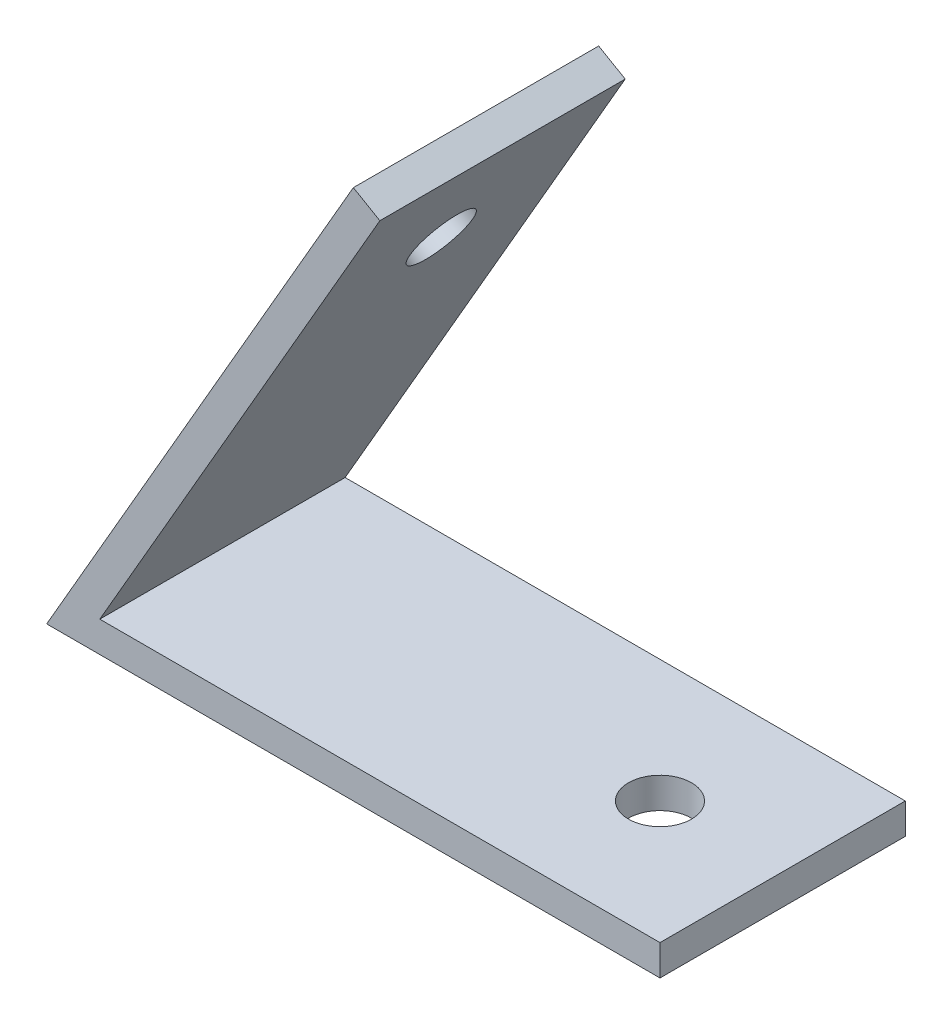
ISO-10303-21;
HEADER;
FILE_DESCRIPTION(('STEP AP214'),'2;1');
FILE_NAME('part.step','',(''),(''),'','','');
FILE_SCHEMA(('AUTOMOTIVE_DESIGN { 1 0 10303 214 1 1 1 1 }'));
ENDSEC;
DATA;
#1=APPLICATION_CONTEXT('core data for automotive mechanical design processes');
#2=APPLICATION_PROTOCOL_DEFINITION('international standard','automotive_design',2000,#1);
#3=PRODUCT_CONTEXT('',#1,'mechanical');
#4=PRODUCT('Part','Part','',(#3));
#5=PRODUCT_RELATED_PRODUCT_CATEGORY('part','',(#4));
#6=PRODUCT_DEFINITION_FORMATION('','',#4);
#7=PRODUCT_DEFINITION_CONTEXT('part definition',#1,'design');
#8=PRODUCT_DEFINITION('design','',#6,#7);
#9=PRODUCT_DEFINITION_SHAPE('','',#8);
#10=(LENGTH_UNIT() NAMED_UNIT(*) SI_UNIT(.MILLI.,.METRE.));
#11=(NAMED_UNIT(*) PLANE_ANGLE_UNIT() SI_UNIT($,.RADIAN.));
#12=(NAMED_UNIT(*) SI_UNIT($,.STERADIAN.) SOLID_ANGLE_UNIT());
#13=UNCERTAINTY_MEASURE_WITH_UNIT(LENGTH_MEASURE(1.E-05),#10,'distance_accuracy_value','');
#14=(GEOMETRIC_REPRESENTATION_CONTEXT(3) GLOBAL_UNCERTAINTY_ASSIGNED_CONTEXT((#13)) GLOBAL_UNIT_ASSIGNED_CONTEXT((#10,
#11,#12)) REPRESENTATION_CONTEXT('',''));
#15=CARTESIAN_POINT('',(0.,0.,0.));
#16=DIRECTION('',(0.,0.,1.));
#17=DIRECTION('',(1.,0.,0.));
#18=AXIS2_PLACEMENT_3D('',#15,#16,#17);
#19=CARTESIAN_POINT('',(31.75,0.,12.7));
#20=DIRECTION('',(-1.,0.,0.));
#21=DIRECTION('',(0.,0.,1.));
#22=AXIS2_PLACEMENT_3D('',#19,#20,#21);
#23=PLANE('',#22);
#24=DIRECTION('',(0.,1.,0.));
#25=VECTOR('',#24,1.);
#26=CARTESIAN_POINT('',(31.75,0.,0.));
#27=LINE('',#26,#25);
#28=CARTESIAN_POINT('',(31.75,0.,0.));
#29=VERTEX_POINT('',#28);
#30=CARTESIAN_POINT('',(31.75,1.5875,0.));
#31=VERTEX_POINT('',#30);
#32=EDGE_CURVE('E141',#29,#31,#27,.T.);
#33=ORIENTED_EDGE('',*,*,#32,.T.);
#34=DIRECTION('',(0.,0.,-1.));
#35=VECTOR('',#34,1.);
#36=CARTESIAN_POINT('',(31.75,1.5875,12.7));
#37=LINE('',#36,#35);
#38=CARTESIAN_POINT('',(31.75,1.5875,12.7));
#39=VERTEX_POINT('',#38);
#40=EDGE_CURVE('E11',#39,#31,#37,.T.);
#41=ORIENTED_EDGE('',*,*,#40,.F.);
#42=DIRECTION('',(0.,1.,0.));
#43=VECTOR('',#42,1.);
#44=CARTESIAN_POINT('',(31.75,0.,12.7));
#45=LINE('',#44,#43);
#46=CARTESIAN_POINT('',(31.75,0.,12.7));
#47=VERTEX_POINT('',#46);
#48=EDGE_CURVE('E157',#47,#39,#45,.T.);
#49=ORIENTED_EDGE('',*,*,#48,.F.);
#50=DIRECTION('',(0.,0.,-1.));
#51=VECTOR('',#50,1.);
#52=CARTESIAN_POINT('',(31.75,0.,12.7));
#53=LINE('',#52,#51);
#54=EDGE_CURVE('E137',#47,#29,#53,.T.);
#55=ORIENTED_EDGE('',*,*,#54,.T.);
#56=EDGE_LOOP('',(#33,#41,#49,#55));
#57=FACE_BOUND('',#56,.T.);
#58=ADVANCED_FACE('F38',(#57),#23,.F.);
#59=CARTESIAN_POINT('',(2.74963065701557,1.5875,12.7));
#60=DIRECTION('',(0.,-1.,0.));
#61=DIRECTION('',(0.,0.,-1.));
#62=AXIS2_PLACEMENT_3D('',#59,#60,#61);
#63=PLANE('',#62);
#64=CARTESIAN_POINT('',(25.4,1.5875,6.35));
#65=DIRECTION('',(0.,-1.,0.));
#66=DIRECTION('',(0.,0.,-1.));
#67=AXIS2_PLACEMENT_3D('',#64,#65,#66);
#68=CIRCLE('',#67,1.63194999999999);
#69=CARTESIAN_POINT('',(25.4,1.5875,4.71805000000001));
#70=VERTEX_POINT('',#69);
#71=EDGE_CURVE('E146',#70,#70,#68,.T.);
#72=ORIENTED_EDGE('',*,*,#71,.T.);
#73=EDGE_LOOP('',(#72));
#74=FACE_BOUND('',#73,.T.);
#75=DIRECTION('',(-1.,0.,0.));
#76=VECTOR('',#75,1.);
#77=CARTESIAN_POINT('',(2.74963065701557,1.5875,0.));
#78=LINE('',#77,#76);
#79=CARTESIAN_POINT('',(2.74963065701557,1.5875,0.));
#80=VERTEX_POINT('',#79);
#81=EDGE_CURVE('E145',#31,#80,#78,.T.);
#82=ORIENTED_EDGE('',*,*,#81,.T.);
#83=DIRECTION('',(0.,0.,-1.));
#84=VECTOR('',#83,1.);
#85=CARTESIAN_POINT('',(2.74963065701557,1.5875,12.7));
#86=LINE('',#85,#84);
#87=CARTESIAN_POINT('',(2.74963065701557,1.5875,12.7));
#88=VERTEX_POINT('',#87);
#89=EDGE_CURVE('E47',#88,#80,#86,.T.);
#90=ORIENTED_EDGE('',*,*,#89,.F.);
#91=DIRECTION('',(-1.,0.,0.));
#92=VECTOR('',#91,1.);
#93=CARTESIAN_POINT('',(2.74963065701557,1.5875,12.7));
#94=LINE('',#93,#92);
#95=EDGE_CURVE('E104',#39,#88,#94,.T.);
#96=ORIENTED_EDGE('',*,*,#95,.F.);
#97=ORIENTED_EDGE('',*,*,#40,.T.);
#98=EDGE_LOOP('',(#82,#90,#96,#97));
#99=FACE_BOUND('',#98,.T.);
#100=ADVANCED_FACE('F189',(#74,#99),#63,.F.);
#101=CARTESIAN_POINT('',(2.74963065701557,1.5875,12.7));
#102=DIRECTION('',(-0.86602540378444,0.499999999999998,0.));
#103=DIRECTION('',(-0.499999999999998,-0.86602540378444,0.));
#104=AXIS2_PLACEMENT_3D('',#101,#102,#103);
#105=PLANE('',#104);
#106=CARTESIAN_POINT('',(14.0748153285077,21.2032952561248,6.35));
#107=DIRECTION('',(-0.86602540378444,0.499999999999998,0.));
#108=DIRECTION('',(-0.499999999999998,-0.86602540378444,0.));
#109=AXIS2_PLACEMENT_3D('',#106,#107,#108);
#110=CIRCLE('',#109,1.63194999999999);
#111=CARTESIAN_POINT('',(13.2588403285077,19.7899850984188,6.35));
#112=VERTEX_POINT('',#111);
#113=EDGE_CURVE('E274',#112,#112,#110,.T.);
#114=ORIENTED_EDGE('',*,*,#113,.T.);
#115=EDGE_LOOP('',(#114));
#116=FACE_BOUND('',#115,.T.);
#117=DIRECTION('',(0.499999999999998,0.86602540378444,0.));
#118=VECTOR('',#117,1.);
#119=CARTESIAN_POINT('',(2.74963065701557,1.5875,0.));
#120=LINE('',#119,#118);
#121=CARTESIAN_POINT('',(17.2498153285077,26.702556570156,0.));
#122=VERTEX_POINT('',#121);
#123=EDGE_CURVE('E149',#80,#122,#120,.T.);
#124=ORIENTED_EDGE('',*,*,#123,.T.);
#125=DIRECTION('',(0.,0.,-1.));
#126=VECTOR('',#125,1.);
#127=CARTESIAN_POINT('',(17.2498153285077,26.702556570156,12.7));
#128=LINE('',#127,#126);
#129=CARTESIAN_POINT('',(17.2498153285077,26.702556570156,12.7));
#130=VERTEX_POINT('',#129);
#131=EDGE_CURVE('E128',#130,#122,#128,.T.);
#132=ORIENTED_EDGE('',*,*,#131,.F.);
#133=DIRECTION('',(0.499999999999998,0.86602540378444,0.));
#134=VECTOR('',#133,1.);
#135=CARTESIAN_POINT('',(2.74963065701557,1.5875,12.7));
#136=LINE('',#135,#134);
#137=EDGE_CURVE('E117',#88,#130,#136,.T.);
#138=ORIENTED_EDGE('',*,*,#137,.F.);
#139=ORIENTED_EDGE('',*,*,#89,.T.);
#140=EDGE_LOOP('',(#124,#132,#138,#139));
#141=FACE_BOUND('',#140,.T.);
#142=ADVANCED_FACE('F167',(#116,#141),#105,.F.);
#143=CARTESIAN_POINT('',(17.2498153285077,26.702556570156,12.7));
#144=DIRECTION('',(-0.499999999999996,-0.866025403784441,0.));
#145=DIRECTION('',(0.866025403784441,-0.499999999999996,0.));
#146=AXIS2_PLACEMENT_3D('',#143,#144,#145);
#147=PLANE('',#146);
#148=DIRECTION('',(-0.866025403784441,0.499999999999996,0.));
#149=VECTOR('',#148,1.);
#150=CARTESIAN_POINT('',(17.2498153285077,26.702556570156,0.));
#151=LINE('',#150,#149);
#152=CARTESIAN_POINT('',(15.8749999999999,27.496306570156,0.));
#153=VERTEX_POINT('',#152);
#154=EDGE_CURVE('E126',#122,#153,#151,.T.);
#155=ORIENTED_EDGE('',*,*,#154,.T.);
#156=DIRECTION('',(0.,0.,-1.));
#157=VECTOR('',#156,1.);
#158=CARTESIAN_POINT('',(15.8749999999999,27.496306570156,12.7));
#159=LINE('',#158,#157);
#160=CARTESIAN_POINT('',(15.8749999999999,27.496306570156,12.7));
#161=VERTEX_POINT('',#160);
#162=EDGE_CURVE('E123',#161,#153,#159,.T.);
#163=ORIENTED_EDGE('',*,*,#162,.F.);
#164=DIRECTION('',(-0.866025403784441,0.499999999999996,0.));
#165=VECTOR('',#164,1.);
#166=CARTESIAN_POINT('',(17.2498153285077,26.702556570156,12.7));
#167=LINE('',#166,#165);
#168=EDGE_CURVE('E111',#130,#161,#167,.T.);
#169=ORIENTED_EDGE('',*,*,#168,.F.);
#170=ORIENTED_EDGE('',*,*,#131,.T.);
#171=EDGE_LOOP('',(#155,#163,#169,#170));
#172=FACE_BOUND('',#171,.T.);
#173=ADVANCED_FACE('F124',(#172),#147,.F.);
#174=CARTESIAN_POINT('',(15.8749999999999,27.496306570156,12.7));
#175=DIRECTION('',(0.86602540378444,-0.499999999999997,0.));
#176=DIRECTION('',(0.499999999999997,0.86602540378444,0.));
#177=AXIS2_PLACEMENT_3D('',#174,#175,#176);
#178=PLANE('',#177);
#179=CARTESIAN_POINT('',(12.6999999999999,21.9970452561248,6.35));
#180=DIRECTION('',(-0.86602540378444,0.499999999999997,0.));
#181=DIRECTION('',(-0.499999999999997,-0.86602540378444,0.));
#182=AXIS2_PLACEMENT_3D('',#179,#180,#181);
#183=CIRCLE('',#182,1.63194999999999);
#184=CARTESIAN_POINT('',(11.8840249999999,20.5837350984188,6.35));
#185=VERTEX_POINT('',#184);
#186=EDGE_CURVE('E277',#185,#185,#183,.T.);
#187=ORIENTED_EDGE('',*,*,#186,.F.);
#188=EDGE_LOOP('',(#187));
#189=FACE_BOUND('',#188,.T.);
#190=DIRECTION('',(-0.499999999999997,-0.86602540378444,0.));
#191=VECTOR('',#190,1.);
#192=CARTESIAN_POINT('',(15.8749999999999,27.496306570156,0.));
#193=LINE('',#192,#191);
#194=CARTESIAN_POINT('',(0.,0.,0.));
#195=VERTEX_POINT('',#194);
#196=EDGE_CURVE('E87',#153,#195,#193,.T.);
#197=ORIENTED_EDGE('',*,*,#196,.T.);
#198=DIRECTION('',(0.,0.,-1.));
#199=VECTOR('',#198,1.);
#200=CARTESIAN_POINT('',(0.,0.,12.7));
#201=LINE('',#200,#199);
#202=CARTESIAN_POINT('',(0.,0.,12.7));
#203=VERTEX_POINT('',#202);
#204=EDGE_CURVE('E129',#203,#195,#201,.T.);
#205=ORIENTED_EDGE('',*,*,#204,.F.);
#206=DIRECTION('',(-0.499999999999997,-0.86602540378444,0.));
#207=VECTOR('',#206,1.);
#208=CARTESIAN_POINT('',(15.8749999999999,27.496306570156,12.7));
#209=LINE('',#208,#207);
#210=EDGE_CURVE('E115',#161,#203,#209,.T.);
#211=ORIENTED_EDGE('',*,*,#210,.F.);
#212=ORIENTED_EDGE('',*,*,#162,.T.);
#213=EDGE_LOOP('',(#197,#205,#211,#212));
#214=FACE_BOUND('',#213,.T.);
#215=ADVANCED_FACE('F131',(#189,#214),#178,.F.);
#216=CARTESIAN_POINT('',(0.,0.,12.7));
#217=DIRECTION('',(0.,1.,0.));
#218=DIRECTION('',(0.,0.,1.));
#219=AXIS2_PLACEMENT_3D('',#216,#217,#218);
#220=PLANE('',#219);
#221=CARTESIAN_POINT('',(25.4,0.,6.35));
#222=DIRECTION('',(0.,-1.,0.));
#223=DIRECTION('',(0.,0.,-1.));
#224=AXIS2_PLACEMENT_3D('',#221,#222,#223);
#225=CIRCLE('',#224,1.63194999999999);
#226=CARTESIAN_POINT('',(25.4,0.,4.71805000000001));
#227=VERTEX_POINT('',#226);
#228=EDGE_CURVE('E281',#227,#227,#225,.T.);
#229=ORIENTED_EDGE('',*,*,#228,.F.);
#230=EDGE_LOOP('',(#229));
#231=FACE_BOUND('',#230,.T.);
#232=DIRECTION('',(1.,0.,0.));
#233=VECTOR('',#232,1.);
#234=CARTESIAN_POINT('',(0.,0.,0.));
#235=LINE('',#234,#233);
#236=EDGE_CURVE('E95',#195,#29,#235,.T.);
#237=ORIENTED_EDGE('',*,*,#236,.T.);
#238=ORIENTED_EDGE('',*,*,#54,.F.);
#239=DIRECTION('',(1.,0.,0.));
#240=VECTOR('',#239,1.);
#241=CARTESIAN_POINT('',(0.,0.,12.7));
#242=LINE('',#241,#240);
#243=EDGE_CURVE('E57',#203,#47,#242,.T.);
#244=ORIENTED_EDGE('',*,*,#243,.F.);
#245=ORIENTED_EDGE('',*,*,#204,.T.);
#246=EDGE_LOOP('',(#237,#238,#244,#245));
#247=FACE_BOUND('',#246,.T.);
#248=ADVANCED_FACE('F174',(#231,#247),#220,.F.);
#249=CARTESIAN_POINT('',(0.,0.,12.7));
#250=DIRECTION('',(0.,0.,-1.));
#251=DIRECTION('',(-1.,0.,0.));
#252=AXIS2_PLACEMENT_3D('',#249,#250,#251);
#253=PLANE('',#252);
#254=ORIENTED_EDGE('',*,*,#48,.T.);
#255=ORIENTED_EDGE('',*,*,#95,.T.);
#256=ORIENTED_EDGE('',*,*,#137,.T.);
#257=ORIENTED_EDGE('',*,*,#168,.T.);
#258=ORIENTED_EDGE('',*,*,#210,.T.);
#259=ORIENTED_EDGE('',*,*,#243,.T.);
#260=EDGE_LOOP('',(#254,#255,#256,#257,#258,#259));
#261=FACE_BOUND('',#260,.T.);
#262=ADVANCED_FACE('F113',(#261),#253,.F.);
#263=CARTESIAN_POINT('',(0.,0.,0.));
#264=DIRECTION('',(0.,0.,-1.));
#265=DIRECTION('',(-1.,0.,0.));
#266=AXIS2_PLACEMENT_3D('',#263,#264,#265);
#267=PLANE('',#266);
#268=ORIENTED_EDGE('',*,*,#32,.F.);
#269=ORIENTED_EDGE('',*,*,#236,.F.);
#270=ORIENTED_EDGE('',*,*,#196,.F.);
#271=ORIENTED_EDGE('',*,*,#154,.F.);
#272=ORIENTED_EDGE('',*,*,#123,.F.);
#273=ORIENTED_EDGE('',*,*,#81,.F.);
#274=EDGE_LOOP('',(#268,#269,#270,#271,#272,#273));
#275=FACE_BOUND('',#274,.T.);
#276=ADVANCED_FACE('F170',(#275),#267,.T.);
#277=CARTESIAN_POINT('',(25.4,0.,6.35));
#278=DIRECTION('',(0.,-1.,0.));
#279=DIRECTION('',(0.,0.,-1.));
#280=AXIS2_PLACEMENT_3D('',#277,#278,#279);
#281=CYLINDRICAL_SURFACE('',#280,1.63194999999999);
#282=ORIENTED_EDGE('',*,*,#71,.F.);
#283=EDGE_LOOP('',(#282));
#284=FACE_BOUND('',#283,.T.);
#285=ORIENTED_EDGE('',*,*,#228,.T.);
#286=EDGE_LOOP('',(#285));
#287=FACE_BOUND('',#286,.T.);
#288=ADVANCED_FACE('F227',(#284,#287),#281,.F.);
#289=CARTESIAN_POINT('',(12.6999999999999,21.9970452561248,6.35));
#290=DIRECTION('',(-0.86602540378444,0.499999999999997,0.));
#291=DIRECTION('',(-0.499999999999997,-0.86602540378444,0.));
#292=AXIS2_PLACEMENT_3D('',#289,#290,#291);
#293=CYLINDRICAL_SURFACE('',#292,1.63194999999999);
#294=ORIENTED_EDGE('',*,*,#113,.F.);
#295=EDGE_LOOP('',(#294));
#296=FACE_BOUND('',#295,.T.);
#297=ORIENTED_EDGE('',*,*,#186,.T.);
#298=EDGE_LOOP('',(#297));
#299=FACE_BOUND('',#298,.T.);
#300=ADVANCED_FACE('F233',(#296,#299),#293,.F.);
#301=CLOSED_SHELL('',(#58,#100,#142,#173,#215,#248,#262,#276,#288,#300));
#302=MANIFOLD_SOLID_BREP('B2',#301);
#303=ADVANCED_BREP_SHAPE_REPRESENTATION('',(#18,#302),#14);
#304=SHAPE_DEFINITION_REPRESENTATION(#9,#303);
ENDSEC;
END-ISO-10303-21;
